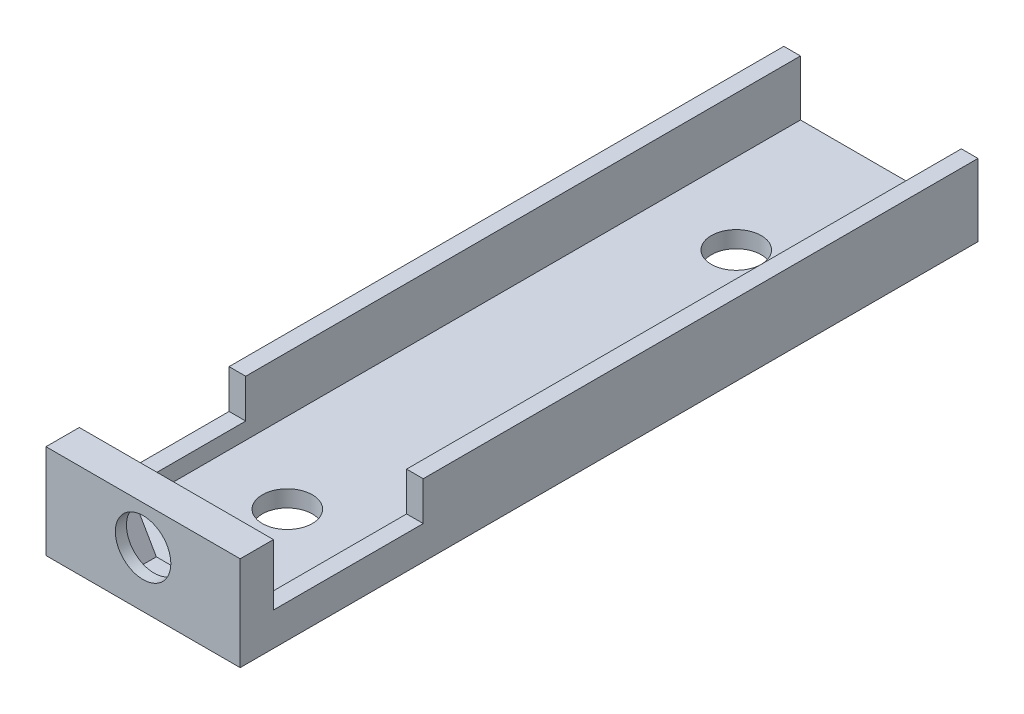
ISO-10303-21;
HEADER;
FILE_DESCRIPTION(('STEP AP214'),'2;1');
FILE_NAME('part.step','',(''),(''),'','','');
FILE_SCHEMA(('AUTOMOTIVE_DESIGN { 1 0 10303 214 1 1 1 1 }'));
ENDSEC;
DATA;
#1=APPLICATION_CONTEXT('core data for automotive mechanical design processes');
#2=APPLICATION_PROTOCOL_DEFINITION('international standard','automotive_design',2000,#1);
#3=PRODUCT_CONTEXT('',#1,'mechanical');
#4=PRODUCT('Part','Part','',(#3));
#5=PRODUCT_RELATED_PRODUCT_CATEGORY('part','',(#4));
#6=PRODUCT_DEFINITION_FORMATION('','',#4);
#7=PRODUCT_DEFINITION_CONTEXT('part definition',#1,'design');
#8=PRODUCT_DEFINITION('design','',#6,#7);
#9=PRODUCT_DEFINITION_SHAPE('','',#8);
#10=(LENGTH_UNIT() NAMED_UNIT(*) SI_UNIT(.MILLI.,.METRE.));
#11=(NAMED_UNIT(*) PLANE_ANGLE_UNIT() SI_UNIT($,.RADIAN.));
#12=(NAMED_UNIT(*) SI_UNIT($,.STERADIAN.) SOLID_ANGLE_UNIT());
#13=UNCERTAINTY_MEASURE_WITH_UNIT(LENGTH_MEASURE(1.E-05),#10,'distance_accuracy_value','');
#14=(GEOMETRIC_REPRESENTATION_CONTEXT(3) GLOBAL_UNCERTAINTY_ASSIGNED_CONTEXT((#13)) GLOBAL_UNIT_ASSIGNED_CONTEXT((#10,
#11,#12)) REPRESENTATION_CONTEXT('',''));
#15=CARTESIAN_POINT('',(0.,0.,0.));
#16=DIRECTION('',(0.,0.,1.));
#17=DIRECTION('',(1.,0.,0.));
#18=AXIS2_PLACEMENT_3D('',#15,#16,#17);
#19=CARTESIAN_POINT('',(32.,3.,100.));
#20=DIRECTION('',(1.,0.,0.));
#21=DIRECTION('',(0.,0.,-1.));
#22=AXIS2_PLACEMENT_3D('',#19,#20,#21);
#23=PLANE('',#22);
#24=DIRECTION('',(0.,-1.,0.));
#25=VECTOR('',#24,1.);
#26=CARTESIAN_POINT('',(32.,3.,127.));
#27=LINE('',#26,#25);
#28=CARTESIAN_POINT('',(32.,5.99999999999999,127.));
#29=VERTEX_POINT('',#28);
#30=CARTESIAN_POINT('',(32.,3.,127.));
#31=VERTEX_POINT('',#30);
#32=EDGE_CURVE('E303',#29,#31,#27,.T.);
#33=ORIENTED_EDGE('',*,*,#32,.F.);
#34=DIRECTION('',(0.,0.,-1.));
#35=VECTOR('',#34,1.);
#36=CARTESIAN_POINT('',(32.,5.99999999999999,131.));
#37=LINE('',#36,#35);
#38=CARTESIAN_POINT('',(32.,5.99999999999999,100.));
#39=VERTEX_POINT('',#38);
#40=EDGE_CURVE('E349',#29,#39,#37,.T.);
#41=ORIENTED_EDGE('',*,*,#40,.T.);
#42=DIRECTION('',(0.,-1.,0.));
#43=VECTOR('',#42,1.);
#44=CARTESIAN_POINT('',(32.,3.,100.));
#45=LINE('',#44,#43);
#46=CARTESIAN_POINT('',(32.,13.,100.));
#47=VERTEX_POINT('',#46);
#48=EDGE_CURVE('E364',#47,#39,#45,.T.);
#49=ORIENTED_EDGE('',*,*,#48,.F.);
#50=DIRECTION('',(0.,0.,-1.));
#51=VECTOR('',#50,1.);
#52=CARTESIAN_POINT('',(32.,13.,100.));
#53=LINE('',#52,#51);
#54=CARTESIAN_POINT('',(32.,13.,0.));
#55=VERTEX_POINT('',#54);
#56=EDGE_CURVE('E412',#47,#55,#53,.T.);
#57=ORIENTED_EDGE('',*,*,#56,.T.);
#58=DIRECTION('',(0.,-1.,0.));
#59=VECTOR('',#58,1.);
#60=CARTESIAN_POINT('',(32.,3.,0.));
#61=LINE('',#60,#59);
#62=CARTESIAN_POINT('',(32.,3.,0.));
#63=VERTEX_POINT('',#62);
#64=EDGE_CURVE('E384',#55,#63,#61,.T.);
#65=ORIENTED_EDGE('',*,*,#64,.T.);
#66=DIRECTION('',(0.,0.,-1.));
#67=VECTOR('',#66,1.);
#68=CARTESIAN_POINT('',(32.,3.,100.));
#69=LINE('',#68,#67);
#70=EDGE_CURVE('E409',#31,#63,#69,.T.);
#71=ORIENTED_EDGE('',*,*,#70,.F.);
#72=EDGE_LOOP('',(#33,#41,#49,#57,#65,#71));
#73=FACE_BOUND('',#72,.T.);
#74=ADVANCED_FACE('F45',(#73),#23,.F.);
#75=CARTESIAN_POINT('',(3.,2.99999999999999,100.));
#76=DIRECTION('',(0.,-1.,0.));
#77=DIRECTION('',(1.,0.,0.));
#78=AXIS2_PLACEMENT_3D('',#75,#76,#77);
#79=PLANE('',#78);
#80=CARTESIAN_POINT('',(17.5,3.,107.));
#81=DIRECTION('',(0.,1.,0.));
#82=DIRECTION('',(-1.,0.,0.));
#83=AXIS2_PLACEMENT_3D('',#80,#81,#82);
#84=CIRCLE('',#83,4.50000000000001);
#85=CARTESIAN_POINT('',(13.,2.99999999999999,107.));
#86=VERTEX_POINT('',#85);
#87=EDGE_CURVE('E235',#86,#86,#84,.T.);
#88=ORIENTED_EDGE('',*,*,#87,.F.);
#89=EDGE_LOOP('',(#88));
#90=FACE_BOUND('',#89,.T.);
#91=CARTESIAN_POINT('',(17.5,3.,26.075));
#92=DIRECTION('',(0.,1.,0.));
#93=DIRECTION('',(-1.,0.,0.));
#94=AXIS2_PLACEMENT_3D('',#91,#92,#93);
#95=CIRCLE('',#94,4.5);
#96=CARTESIAN_POINT('',(13.,2.99999999999999,26.075));
#97=VERTEX_POINT('',#96);
#98=EDGE_CURVE('E239',#97,#97,#95,.T.);
#99=ORIENTED_EDGE('',*,*,#98,.F.);
#100=EDGE_LOOP('',(#99));
#101=FACE_BOUND('',#100,.T.);
#102=DIRECTION('',(-1.,0.,0.));
#103=VECTOR('',#102,1.);
#104=CARTESIAN_POINT('',(3.,2.99999999999999,127.));
#105=LINE('',#104,#103);
#106=CARTESIAN_POINT('',(3.,2.99999999999999,127.));
#107=VERTEX_POINT('',#106);
#108=EDGE_CURVE('E331',#31,#107,#105,.T.);
#109=ORIENTED_EDGE('',*,*,#108,.F.);
#110=ORIENTED_EDGE('',*,*,#70,.T.);
#111=DIRECTION('',(-1.,0.,0.));
#112=VECTOR('',#111,1.);
#113=CARTESIAN_POINT('',(3.,2.99999999999999,0.));
#114=LINE('',#113,#112);
#115=CARTESIAN_POINT('',(3.,2.99999999999999,0.));
#116=VERTEX_POINT('',#115);
#117=EDGE_CURVE('E388',#63,#116,#114,.T.);
#118=ORIENTED_EDGE('',*,*,#117,.T.);
#119=DIRECTION('',(0.,0.,-1.));
#120=VECTOR('',#119,1.);
#121=CARTESIAN_POINT('',(3.,2.99999999999999,100.));
#122=LINE('',#121,#120);
#123=EDGE_CURVE('E406',#107,#116,#122,.T.);
#124=ORIENTED_EDGE('',*,*,#123,.F.);
#125=EDGE_LOOP('',(#109,#110,#118,#124));
#126=FACE_BOUND('',#125,.T.);
#127=ADVANCED_FACE('F469',(#90,#101,#126),#79,.F.);
#128=CARTESIAN_POINT('',(3.,13.,100.));
#129=DIRECTION('',(-1.,0.,0.));
#130=DIRECTION('',(0.,-1.,0.));
#131=AXIS2_PLACEMENT_3D('',#128,#129,#130);
#132=PLANE('',#131);
#133=DIRECTION('',(0.,1.,0.));
#134=VECTOR('',#133,1.);
#135=CARTESIAN_POINT('',(3.,13.,127.));
#136=LINE('',#135,#134);
#137=CARTESIAN_POINT('',(3.,5.99999999999999,127.));
#138=VERTEX_POINT('',#137);
#139=EDGE_CURVE('E334',#107,#138,#136,.T.);
#140=ORIENTED_EDGE('',*,*,#139,.F.);
#141=ORIENTED_EDGE('',*,*,#123,.T.);
#142=DIRECTION('',(0.,1.,0.));
#143=VECTOR('',#142,1.);
#144=CARTESIAN_POINT('',(3.,13.,0.));
#145=LINE('',#144,#143);
#146=CARTESIAN_POINT('',(3.,13.,0.));
#147=VERTEX_POINT('',#146);
#148=EDGE_CURVE('E392',#116,#147,#145,.T.);
#149=ORIENTED_EDGE('',*,*,#148,.T.);
#150=DIRECTION('',(0.,0.,-1.));
#151=VECTOR('',#150,1.);
#152=CARTESIAN_POINT('',(3.,13.,100.));
#153=LINE('',#152,#151);
#154=CARTESIAN_POINT('',(3.,13.,100.));
#155=VERTEX_POINT('',#154);
#156=EDGE_CURVE('E402',#155,#147,#153,.T.);
#157=ORIENTED_EDGE('',*,*,#156,.F.);
#158=DIRECTION('',(0.,1.,0.));
#159=VECTOR('',#158,1.);
#160=CARTESIAN_POINT('',(3.,13.,100.));
#161=LINE('',#160,#159);
#162=CARTESIAN_POINT('',(3.,5.99999999999999,100.));
#163=VERTEX_POINT('',#162);
#164=EDGE_CURVE('E368',#163,#155,#161,.T.);
#165=ORIENTED_EDGE('',*,*,#164,.F.);
#166=DIRECTION('',(0.,0.,-1.));
#167=VECTOR('',#166,1.);
#168=CARTESIAN_POINT('',(3.,5.99999999999999,131.));
#169=LINE('',#168,#167);
#170=EDGE_CURVE('E69',#138,#163,#169,.T.);
#171=ORIENTED_EDGE('',*,*,#170,.F.);
#172=EDGE_LOOP('',(#140,#141,#149,#157,#165,#171));
#173=FACE_BOUND('',#172,.T.);
#174=ADVANCED_FACE('F459',(#173),#132,.F.);
#175=CARTESIAN_POINT('',(0.,5.99999999999999,131.));
#176=DIRECTION('',(0.,-1.,0.));
#177=DIRECTION('',(0.,0.,-1.));
#178=AXIS2_PLACEMENT_3D('',#175,#176,#177);
#179=PLANE('',#178);
#180=DIRECTION('',(-1.,0.,0.));
#181=VECTOR('',#180,1.);
#182=CARTESIAN_POINT('',(0.,5.99999999999999,127.));
#183=LINE('',#182,#181);
#184=CARTESIAN_POINT('',(0.,5.99999999999999,127.));
#185=VERTEX_POINT('',#184);
#186=EDGE_CURVE('E337',#138,#185,#183,.T.);
#187=ORIENTED_EDGE('',*,*,#186,.F.);
#188=ORIENTED_EDGE('',*,*,#170,.T.);
#189=DIRECTION('',(-1.,0.,0.));
#190=VECTOR('',#189,1.);
#191=CARTESIAN_POINT('',(0.,5.99999999999999,100.));
#192=LINE('',#191,#190);
#193=CARTESIAN_POINT('',(0.,5.99999999999999,100.));
#194=VERTEX_POINT('',#193);
#195=EDGE_CURVE('E340',#163,#194,#192,.T.);
#196=ORIENTED_EDGE('',*,*,#195,.T.);
#197=DIRECTION('',(0.,0.,-1.));
#198=VECTOR('',#197,1.);
#199=CARTESIAN_POINT('',(0.,5.99999999999999,131.));
#200=LINE('',#199,#198);
#201=EDGE_CURVE('E61',#185,#194,#200,.T.);
#202=ORIENTED_EDGE('',*,*,#201,.F.);
#203=EDGE_LOOP('',(#187,#188,#196,#202));
#204=FACE_BOUND('',#203,.T.);
#205=ADVANCED_FACE('F452',(#204),#179,.F.);
#206=CARTESIAN_POINT('',(32.,5.99999999999999,131.));
#207=DIRECTION('',(0.,-1.,0.));
#208=DIRECTION('',(0.,0.,-1.));
#209=AXIS2_PLACEMENT_3D('',#206,#207,#208);
#210=PLANE('',#209);
#211=DIRECTION('',(-1.,0.,0.));
#212=VECTOR('',#211,1.);
#213=CARTESIAN_POINT('',(32.,5.99999999999999,127.));
#214=LINE('',#213,#212);
#215=CARTESIAN_POINT('',(35.,5.99999999999999,127.));
#216=VERTEX_POINT('',#215);
#217=EDGE_CURVE('E11',#216,#29,#214,.T.);
#218=ORIENTED_EDGE('',*,*,#217,.F.);
#219=DIRECTION('',(0.,0.,-1.));
#220=VECTOR('',#219,1.);
#221=CARTESIAN_POINT('',(35.,5.99999999999999,131.));
#222=LINE('',#221,#220);
#223=CARTESIAN_POINT('',(35.,5.99999999999999,100.));
#224=VERTEX_POINT('',#223);
#225=EDGE_CURVE('E352',#216,#224,#222,.T.);
#226=ORIENTED_EDGE('',*,*,#225,.T.);
#227=DIRECTION('',(-1.,0.,0.));
#228=VECTOR('',#227,1.);
#229=CARTESIAN_POINT('',(32.,5.99999999999999,100.));
#230=LINE('',#229,#228);
#231=EDGE_CURVE('E343',#224,#39,#230,.T.);
#232=ORIENTED_EDGE('',*,*,#231,.T.);
#233=ORIENTED_EDGE('',*,*,#40,.F.);
#234=EDGE_LOOP('',(#218,#226,#232,#233));
#235=FACE_BOUND('',#234,.T.);
#236=ADVANCED_FACE('F444',(#235),#210,.F.);
#237=CARTESIAN_POINT('',(0.,0.,100.));
#238=DIRECTION('',(0.,0.,-1.));
#239=DIRECTION('',(-1.,0.,0.));
#240=AXIS2_PLACEMENT_3D('',#237,#238,#239);
#241=PLANE('',#240);
#242=ORIENTED_EDGE('',*,*,#195,.F.);
#243=ORIENTED_EDGE('',*,*,#164,.T.);
#244=DIRECTION('',(-1.,0.,0.));
#245=VECTOR('',#244,1.);
#246=CARTESIAN_POINT('',(0.,13.,100.));
#247=LINE('',#246,#245);
#248=CARTESIAN_POINT('',(0.,13.,100.));
#249=VERTEX_POINT('',#248);
#250=EDGE_CURVE('E371',#155,#249,#247,.T.);
#251=ORIENTED_EDGE('',*,*,#250,.T.);
#252=DIRECTION('',(0.,-1.,0.));
#253=VECTOR('',#252,1.);
#254=CARTESIAN_POINT('',(0.,0.,100.));
#255=LINE('',#254,#253);
#256=EDGE_CURVE('E200',#249,#194,#255,.T.);
#257=ORIENTED_EDGE('',*,*,#256,.T.);
#258=EDGE_LOOP('',(#242,#243,#251,#257));
#259=FACE_BOUND('',#258,.T.);
#260=ADVANCED_FACE('F455',(#259),#241,.F.);
#261=ORIENTED_EDGE('',*,*,#231,.F.);
#262=DIRECTION('',(0.,1.,0.));
#263=VECTOR('',#262,1.);
#264=CARTESIAN_POINT('',(35.,13.,100.));
#265=LINE('',#264,#263);
#266=CARTESIAN_POINT('',(35.,13.,100.));
#267=VERTEX_POINT('',#266);
#268=EDGE_CURVE('E358',#224,#267,#265,.T.);
#269=ORIENTED_EDGE('',*,*,#268,.T.);
#270=DIRECTION('',(-1.,0.,0.));
#271=VECTOR('',#270,1.);
#272=CARTESIAN_POINT('',(32.,13.,100.));
#273=LINE('',#272,#271);
#274=EDGE_CURVE('E361',#267,#47,#273,.T.);
#275=ORIENTED_EDGE('',*,*,#274,.T.);
#276=ORIENTED_EDGE('',*,*,#48,.T.);
#277=EDGE_LOOP('',(#261,#269,#275,#276));
#278=FACE_BOUND('',#277,.T.);
#279=ADVANCED_FACE('F440',(#278),#241,.F.);
#280=CARTESIAN_POINT('',(35.,0.,100.));
#281=DIRECTION('',(0.,1.,0.));
#282=DIRECTION('',(-1.,0.,0.));
#283=AXIS2_PLACEMENT_3D('',#280,#281,#282);
#284=PLANE('',#283);
#285=CARTESIAN_POINT('',(17.5,0.,107.));
#286=DIRECTION('',(0.,1.,0.));
#287=DIRECTION('',(-1.,0.,0.));
#288=AXIS2_PLACEMENT_3D('',#285,#286,#287);
#289=CIRCLE('',#288,4.50000000000001);
#290=CARTESIAN_POINT('',(13.,0.,107.));
#291=VERTEX_POINT('',#290);
#292=EDGE_CURVE('E230',#291,#291,#289,.T.);
#293=ORIENTED_EDGE('',*,*,#292,.T.);
#294=EDGE_LOOP('',(#293));
#295=FACE_BOUND('',#294,.T.);
#296=CARTESIAN_POINT('',(17.5,0.,26.075));
#297=DIRECTION('',(0.,1.,0.));
#298=DIRECTION('',(-1.,0.,0.));
#299=AXIS2_PLACEMENT_3D('',#296,#297,#298);
#300=CIRCLE('',#299,4.5);
#301=CARTESIAN_POINT('',(13.,0.,26.075));
#302=VERTEX_POINT('',#301);
#303=EDGE_CURVE('E228',#302,#302,#300,.T.);
#304=ORIENTED_EDGE('',*,*,#303,.T.);
#305=EDGE_LOOP('',(#304));
#306=FACE_BOUND('',#305,.T.);
#307=DIRECTION('',(0.,0.,-1.));
#308=VECTOR('',#307,1.);
#309=CARTESIAN_POINT('',(0.,0.,100.));
#310=LINE('',#309,#308);
#311=CARTESIAN_POINT('',(0.,0.,133.));
#312=VERTEX_POINT('',#311);
#313=CARTESIAN_POINT('',(0.,0.,0.));
#314=VERTEX_POINT('',#313);
#315=EDGE_CURVE('E185',#312,#314,#310,.T.);
#316=ORIENTED_EDGE('',*,*,#315,.T.);
#317=DIRECTION('',(1.,0.,0.));
#318=VECTOR('',#317,1.);
#319=CARTESIAN_POINT('',(35.,0.,0.));
#320=LINE('',#319,#318);
#321=CARTESIAN_POINT('',(35.,0.,0.));
#322=VERTEX_POINT('',#321);
#323=EDGE_CURVE('E357',#314,#322,#320,.T.);
#324=ORIENTED_EDGE('',*,*,#323,.T.);
#325=DIRECTION('',(0.,0.,-1.));
#326=VECTOR('',#325,1.);
#327=CARTESIAN_POINT('',(35.,0.,100.));
#328=LINE('',#327,#326);
#329=CARTESIAN_POINT('',(35.,0.,133.));
#330=VERTEX_POINT('',#329);
#331=EDGE_CURVE('E54',#330,#322,#328,.T.);
#332=ORIENTED_EDGE('',*,*,#331,.F.);
#333=DIRECTION('',(1.,0.,0.));
#334=VECTOR('',#333,1.);
#335=CARTESIAN_POINT('',(0.,0.,133.));
#336=LINE('',#335,#334);
#337=EDGE_CURVE('E203',#312,#330,#336,.T.);
#338=ORIENTED_EDGE('',*,*,#337,.F.);
#339=EDGE_LOOP('',(#316,#324,#332,#338));
#340=FACE_BOUND('',#339,.T.);
#341=ADVANCED_FACE('F47',(#295,#306,#340),#284,.F.);
#342=CARTESIAN_POINT('',(35.,13.,100.));
#343=DIRECTION('',(-1.,0.,0.));
#344=DIRECTION('',(0.,0.,1.));
#345=AXIS2_PLACEMENT_3D('',#342,#343,#344);
#346=PLANE('',#345);
#347=ORIENTED_EDGE('',*,*,#331,.T.);
#348=DIRECTION('',(0.,1.,0.));
#349=VECTOR('',#348,1.);
#350=CARTESIAN_POINT('',(35.,13.,0.));
#351=LINE('',#350,#349);
#352=CARTESIAN_POINT('',(35.,13.,0.));
#353=VERTEX_POINT('',#352);
#354=EDGE_CURVE('E378',#322,#353,#351,.T.);
#355=ORIENTED_EDGE('',*,*,#354,.T.);
#356=DIRECTION('',(0.,0.,-1.));
#357=VECTOR('',#356,1.);
#358=CARTESIAN_POINT('',(35.,13.,100.));
#359=LINE('',#358,#357);
#360=EDGE_CURVE('E416',#267,#353,#359,.T.);
#361=ORIENTED_EDGE('',*,*,#360,.F.);
#362=ORIENTED_EDGE('',*,*,#268,.F.);
#363=ORIENTED_EDGE('',*,*,#225,.F.);
#364=DIRECTION('',(0.,1.,0.));
#365=VECTOR('',#364,1.);
#366=CARTESIAN_POINT('',(35.,0.,127.));
#367=LINE('',#366,#365);
#368=CARTESIAN_POINT('',(35.,17.,127.));
#369=VERTEX_POINT('',#368);
#370=EDGE_CURVE('E249',#216,#369,#367,.T.);
#371=ORIENTED_EDGE('',*,*,#370,.T.);
#372=DIRECTION('',(0.,0.,1.));
#373=VECTOR('',#372,1.);
#374=CARTESIAN_POINT('',(35.,17.,127.));
#375=LINE('',#374,#373);
#376=CARTESIAN_POINT('',(35.,17.,133.));
#377=VERTEX_POINT('',#376);
#378=EDGE_CURVE('E276',#369,#377,#375,.T.);
#379=ORIENTED_EDGE('',*,*,#378,.T.);
#380=DIRECTION('',(0.,1.,0.));
#381=VECTOR('',#380,1.);
#382=CARTESIAN_POINT('',(35.,0.,133.));
#383=LINE('',#382,#381);
#384=EDGE_CURVE('E208',#330,#377,#383,.T.);
#385=ORIENTED_EDGE('',*,*,#384,.F.);
#386=EDGE_LOOP('',(#347,#355,#361,#362,#363,#371,#379,#385));
#387=FACE_BOUND('',#386,.T.);
#388=ADVANCED_FACE('F422',(#387),#346,.F.);
#389=CARTESIAN_POINT('',(32.,13.,100.));
#390=DIRECTION('',(0.,-1.,0.));
#391=DIRECTION('',(1.,0.,0.));
#392=AXIS2_PLACEMENT_3D('',#389,#390,#391);
#393=PLANE('',#392);
#394=DIRECTION('',(-1.,0.,0.));
#395=VECTOR('',#394,1.);
#396=CARTESIAN_POINT('',(32.,13.,0.));
#397=LINE('',#396,#395);
#398=EDGE_CURVE('E381',#353,#55,#397,.T.);
#399=ORIENTED_EDGE('',*,*,#398,.T.);
#400=ORIENTED_EDGE('',*,*,#56,.F.);
#401=ORIENTED_EDGE('',*,*,#274,.F.);
#402=ORIENTED_EDGE('',*,*,#360,.T.);
#403=EDGE_LOOP('',(#399,#400,#401,#402));
#404=FACE_BOUND('',#403,.T.);
#405=ADVANCED_FACE('F431',(#404),#393,.F.);
#406=CARTESIAN_POINT('',(0.,13.,100.));
#407=DIRECTION('',(0.,-1.,0.));
#408=DIRECTION('',(0.,0.,-1.));
#409=AXIS2_PLACEMENT_3D('',#406,#407,#408);
#410=PLANE('',#409);
#411=DIRECTION('',(-1.,0.,0.));
#412=VECTOR('',#411,1.);
#413=CARTESIAN_POINT('',(0.,13.,0.));
#414=LINE('',#413,#412);
#415=CARTESIAN_POINT('',(0.,13.,0.));
#416=VERTEX_POINT('',#415);
#417=EDGE_CURVE('E395',#147,#416,#414,.T.);
#418=ORIENTED_EDGE('',*,*,#417,.T.);
#419=DIRECTION('',(0.,0.,-1.));
#420=VECTOR('',#419,1.);
#421=CARTESIAN_POINT('',(0.,13.,100.));
#422=LINE('',#421,#420);
#423=EDGE_CURVE('E199',#249,#416,#422,.T.);
#424=ORIENTED_EDGE('',*,*,#423,.F.);
#425=ORIENTED_EDGE('',*,*,#250,.F.);
#426=ORIENTED_EDGE('',*,*,#156,.T.);
#427=EDGE_LOOP('',(#418,#424,#425,#426));
#428=FACE_BOUND('',#427,.T.);
#429=ADVANCED_FACE('F465',(#428),#410,.F.);
#430=CARTESIAN_POINT('',(0.,0.,100.));
#431=DIRECTION('',(1.,0.,0.));
#432=DIRECTION('',(0.,0.,-1.));
#433=AXIS2_PLACEMENT_3D('',#430,#431,#432);
#434=PLANE('',#433);
#435=ORIENTED_EDGE('',*,*,#315,.F.);
#436=DIRECTION('',(0.,1.,0.));
#437=VECTOR('',#436,1.);
#438=CARTESIAN_POINT('',(0.,0.,133.));
#439=LINE('',#438,#437);
#440=CARTESIAN_POINT('',(0.,17.,133.));
#441=VERTEX_POINT('',#440);
#442=EDGE_CURVE('E190',#312,#441,#439,.T.);
#443=ORIENTED_EDGE('',*,*,#442,.T.);
#444=DIRECTION('',(0.,0.,1.));
#445=VECTOR('',#444,1.);
#446=CARTESIAN_POINT('',(0.,17.,127.));
#447=LINE('',#446,#445);
#448=CARTESIAN_POINT('',(0.,17.,127.));
#449=VERTEX_POINT('',#448);
#450=EDGE_CURVE('E324',#449,#441,#447,.T.);
#451=ORIENTED_EDGE('',*,*,#450,.F.);
#452=DIRECTION('',(0.,1.,0.));
#453=VECTOR('',#452,1.);
#454=CARTESIAN_POINT('',(0.,0.,127.));
#455=LINE('',#454,#453);
#456=EDGE_CURVE('E246',#185,#449,#455,.T.);
#457=ORIENTED_EDGE('',*,*,#456,.F.);
#458=ORIENTED_EDGE('',*,*,#201,.T.);
#459=ORIENTED_EDGE('',*,*,#256,.F.);
#460=ORIENTED_EDGE('',*,*,#423,.T.);
#461=DIRECTION('',(0.,-1.,0.));
#462=VECTOR('',#461,1.);
#463=CARTESIAN_POINT('',(0.,0.,0.));
#464=LINE('',#463,#462);
#465=EDGE_CURVE('E194',#416,#314,#464,.T.);
#466=ORIENTED_EDGE('',*,*,#465,.T.);
#467=EDGE_LOOP('',(#435,#443,#451,#457,#458,#459,#460,#466));
#468=FACE_BOUND('',#467,.T.);
#469=ADVANCED_FACE('F187',(#468),#434,.F.);
#470=CARTESIAN_POINT('',(0.,0.,0.));
#471=DIRECTION('',(0.,0.,-1.));
#472=DIRECTION('',(-1.,0.,0.));
#473=AXIS2_PLACEMENT_3D('',#470,#471,#472);
#474=PLANE('',#473);
#475=ORIENTED_EDGE('',*,*,#323,.F.);
#476=ORIENTED_EDGE('',*,*,#465,.F.);
#477=ORIENTED_EDGE('',*,*,#417,.F.);
#478=ORIENTED_EDGE('',*,*,#148,.F.);
#479=ORIENTED_EDGE('',*,*,#117,.F.);
#480=ORIENTED_EDGE('',*,*,#64,.F.);
#481=ORIENTED_EDGE('',*,*,#398,.F.);
#482=ORIENTED_EDGE('',*,*,#354,.F.);
#483=EDGE_LOOP('',(#475,#476,#477,#478,#479,#480,#481,#482));
#484=FACE_BOUND('',#483,.T.);
#485=ADVANCED_FACE('F426',(#484),#474,.T.);
#486=CARTESIAN_POINT('',(0.,0.,127.));
#487=DIRECTION('',(0.,0.,1.));
#488=DIRECTION('',(1.,0.,0.));
#489=AXIS2_PLACEMENT_3D('',#486,#487,#488);
#490=PLANE('',#489);
#491=DIRECTION('',(0.5,0.866025403784439,0.));
#492=VECTOR('',#491,1.);
#493=CARTESIAN_POINT('',(14.2075317547305,-8.20272228311384,127.));
#494=LINE('',#493,#492);
#495=CARTESIAN_POINT('',(21.1084391824352,3.75,127.));
#496=VERTEX_POINT('',#495);
#497=CARTESIAN_POINT('',(24.7168783648703,10.,127.));
#498=VERTEX_POINT('',#497);
#499=EDGE_CURVE('E257',#496,#498,#494,.T.);
#500=ORIENTED_EDGE('',*,*,#499,.T.);
#501=DIRECTION('',(-0.5,0.866025403784439,0.));
#502=VECTOR('',#501,1.);
#503=CARTESIAN_POINT('',(22.8677857925749,13.2027222831138,127.));
#504=LINE('',#503,#502);
#505=CARTESIAN_POINT('',(21.1084391824352,16.25,127.));
#506=VERTEX_POINT('',#505);
#507=EDGE_CURVE('E273',#498,#506,#504,.T.);
#508=ORIENTED_EDGE('',*,*,#507,.T.);
#509=DIRECTION('',(-1.,0.,0.));
#510=VECTOR('',#509,1.);
#511=CARTESIAN_POINT('',(0.,16.25,127.));
#512=LINE('',#511,#510);
#513=CARTESIAN_POINT('',(13.8915608175648,16.25,127.));
#514=VERTEX_POINT('',#513);
#515=EDGE_CURVE('E270',#506,#514,#512,.T.);
#516=ORIENTED_EDGE('',*,*,#515,.T.);
#517=DIRECTION('',(-0.5,-0.866025403784438,0.));
#518=VECTOR('',#517,1.);
#519=CARTESIAN_POINT('',(3.38221420742506,-1.95272228311384,127.));
#520=LINE('',#519,#518);
#521=CARTESIAN_POINT('',(10.2831216351297,10.,127.));
#522=VERTEX_POINT('',#521);
#523=EDGE_CURVE('E267',#514,#522,#520,.T.);
#524=ORIENTED_EDGE('',*,*,#523,.T.);
#525=DIRECTION('',(0.5,-0.866025403784439,0.));
#526=VECTOR('',#525,1.);
#527=CARTESIAN_POINT('',(12.0424682452695,6.95272228311383,127.));
#528=LINE('',#527,#526);
#529=CARTESIAN_POINT('',(13.8915608175648,3.75,127.));
#530=VERTEX_POINT('',#529);
#531=EDGE_CURVE('E264',#522,#530,#528,.T.);
#532=ORIENTED_EDGE('',*,*,#531,.T.);
#533=DIRECTION('',(1.,0.,0.));
#534=VECTOR('',#533,1.);
#535=CARTESIAN_POINT('',(0.,3.75,127.));
#536=LINE('',#535,#534);
#537=EDGE_CURVE('E261',#530,#496,#536,.T.);
#538=ORIENTED_EDGE('',*,*,#537,.T.);
#539=EDGE_LOOP('',(#500,#508,#516,#524,#532,#538));
#540=FACE_BOUND('',#539,.T.);
#541=ORIENTED_EDGE('',*,*,#139,.T.);
#542=ORIENTED_EDGE('',*,*,#186,.T.);
#543=ORIENTED_EDGE('',*,*,#456,.T.);
#544=DIRECTION('',(1.,0.,0.));
#545=VECTOR('',#544,1.);
#546=CARTESIAN_POINT('',(0.,17.,127.));
#547=LINE('',#546,#545);
#548=EDGE_CURVE('E253',#449,#369,#547,.T.);
#549=ORIENTED_EDGE('',*,*,#548,.T.);
#550=ORIENTED_EDGE('',*,*,#370,.F.);
#551=ORIENTED_EDGE('',*,*,#217,.T.);
#552=ORIENTED_EDGE('',*,*,#32,.T.);
#553=ORIENTED_EDGE('',*,*,#108,.T.);
#554=EDGE_LOOP('',(#541,#542,#543,#549,#550,#551,#552,#553));
#555=FACE_BOUND('',#554,.T.);
#556=ADVANCED_FACE('F449',(#540,#555),#490,.F.);
#557=CARTESIAN_POINT('',(14.2075317547305,-8.20272228311384,127.));
#558=DIRECTION('',(0.866025403784438,-0.5,0.));
#559=DIRECTION('',(0.5,0.866025403784439,0.));
#560=AXIS2_PLACEMENT_3D('',#557,#558,#559);
#561=PLANE('',#560);
#562=DIRECTION('',(0.5,0.866025403784439,0.));
#563=VECTOR('',#562,1.);
#564=CARTESIAN_POINT('',(14.2075317547305,-8.20272228311384,131.));
#565=LINE('',#564,#563);
#566=CARTESIAN_POINT('',(21.1084391824352,3.75,131.));
#567=VERTEX_POINT('',#566);
#568=CARTESIAN_POINT('',(24.7168783648703,10.,131.));
#569=VERTEX_POINT('',#568);
#570=EDGE_CURVE('E234',#567,#569,#565,.T.);
#571=ORIENTED_EDGE('',*,*,#570,.T.);
#572=DIRECTION('',(0.,0.,1.));
#573=VECTOR('',#572,1.);
#574=CARTESIAN_POINT('',(24.7168783648703,10.,127.));
#575=LINE('',#574,#573);
#576=EDGE_CURVE('E299',#498,#569,#575,.T.);
#577=ORIENTED_EDGE('',*,*,#576,.F.);
#578=ORIENTED_EDGE('',*,*,#499,.F.);
#579=DIRECTION('',(0.,0.,1.));
#580=VECTOR('',#579,1.);
#581=CARTESIAN_POINT('',(21.1084391824352,3.75,127.));
#582=LINE('',#581,#580);
#583=EDGE_CURVE('E320',#496,#567,#582,.T.);
#584=ORIENTED_EDGE('',*,*,#583,.T.);
#585=EDGE_LOOP('',(#571,#577,#578,#584));
#586=FACE_BOUND('',#585,.T.);
#587=ADVANCED_FACE('F517',(#586),#561,.F.);
#588=CARTESIAN_POINT('',(22.8677857925749,13.2027222831138,127.));
#589=DIRECTION('',(0.866025403784439,0.5,0.));
#590=DIRECTION('',(-0.5,0.866025403784439,0.));
#591=AXIS2_PLACEMENT_3D('',#588,#589,#590);
#592=PLANE('',#591);
#593=DIRECTION('',(-0.5,0.866025403784439,0.));
#594=VECTOR('',#593,1.);
#595=CARTESIAN_POINT('',(22.8677857925749,13.2027222831138,131.));
#596=LINE('',#595,#594);
#597=CARTESIAN_POINT('',(21.1084391824352,16.25,131.));
#598=VERTEX_POINT('',#597);
#599=EDGE_CURVE('E250',#569,#598,#596,.T.);
#600=ORIENTED_EDGE('',*,*,#599,.T.);
#601=DIRECTION('',(0.,0.,1.));
#602=VECTOR('',#601,1.);
#603=CARTESIAN_POINT('',(21.1084391824352,16.25,127.));
#604=LINE('',#603,#602);
#605=EDGE_CURVE('E304',#506,#598,#604,.T.);
#606=ORIENTED_EDGE('',*,*,#605,.F.);
#607=ORIENTED_EDGE('',*,*,#507,.F.);
#608=ORIENTED_EDGE('',*,*,#576,.T.);
#609=EDGE_LOOP('',(#600,#606,#607,#608));
#610=FACE_BOUND('',#609,.T.);
#611=ADVANCED_FACE('F519',(#610),#592,.F.);
#612=CARTESIAN_POINT('',(0.,16.25,127.));
#613=DIRECTION('',(0.,1.,0.));
#614=DIRECTION('',(0.,0.,1.));
#615=AXIS2_PLACEMENT_3D('',#612,#613,#614);
#616=PLANE('',#615);
#617=DIRECTION('',(-1.,0.,0.));
#618=VECTOR('',#617,1.);
#619=CARTESIAN_POINT('',(0.,16.25,131.));
#620=LINE('',#619,#618);
#621=CARTESIAN_POINT('',(13.8915608175648,16.25,131.));
#622=VERTEX_POINT('',#621);
#623=EDGE_CURVE('E292',#598,#622,#620,.T.);
#624=ORIENTED_EDGE('',*,*,#623,.T.);
#625=DIRECTION('',(0.,0.,1.));
#626=VECTOR('',#625,1.);
#627=CARTESIAN_POINT('',(13.8915608175648,16.25,127.));
#628=LINE('',#627,#626);
#629=EDGE_CURVE('E308',#514,#622,#628,.T.);
#630=ORIENTED_EDGE('',*,*,#629,.F.);
#631=ORIENTED_EDGE('',*,*,#515,.F.);
#632=ORIENTED_EDGE('',*,*,#605,.T.);
#633=EDGE_LOOP('',(#624,#630,#631,#632));
#634=FACE_BOUND('',#633,.T.);
#635=ADVANCED_FACE('F522',(#634),#616,.F.);
#636=CARTESIAN_POINT('',(3.38221420742506,-1.95272228311384,127.));
#637=DIRECTION('',(-0.866025403784438,0.5,0.));
#638=DIRECTION('',(-0.5,-0.866025403784438,0.));
#639=AXIS2_PLACEMENT_3D('',#636,#637,#638);
#640=PLANE('',#639);
#641=DIRECTION('',(-0.5,-0.866025403784438,0.));
#642=VECTOR('',#641,1.);
#643=CARTESIAN_POINT('',(3.38221420742506,-1.95272228311384,131.));
#644=LINE('',#643,#642);
#645=CARTESIAN_POINT('',(10.2831216351297,10.,131.));
#646=VERTEX_POINT('',#645);
#647=EDGE_CURVE('E288',#622,#646,#644,.T.);
#648=ORIENTED_EDGE('',*,*,#647,.T.);
#649=DIRECTION('',(0.,0.,1.));
#650=VECTOR('',#649,1.);
#651=CARTESIAN_POINT('',(10.2831216351297,10.,127.));
#652=LINE('',#651,#650);
#653=EDGE_CURVE('E312',#522,#646,#652,.T.);
#654=ORIENTED_EDGE('',*,*,#653,.F.);
#655=ORIENTED_EDGE('',*,*,#523,.F.);
#656=ORIENTED_EDGE('',*,*,#629,.T.);
#657=EDGE_LOOP('',(#648,#654,#655,#656));
#658=FACE_BOUND('',#657,.T.);
#659=ADVANCED_FACE('F526',(#658),#640,.F.);
#660=CARTESIAN_POINT('',(12.0424682452695,6.95272228311383,127.));
#661=DIRECTION('',(-0.866025403784439,-0.5,0.));
#662=DIRECTION('',(0.5,-0.866025403784439,0.));
#663=AXIS2_PLACEMENT_3D('',#660,#661,#662);
#664=PLANE('',#663);
#665=DIRECTION('',(0.5,-0.866025403784439,0.));
#666=VECTOR('',#665,1.);
#667=CARTESIAN_POINT('',(12.0424682452695,6.95272228311383,131.));
#668=LINE('',#667,#666);
#669=CARTESIAN_POINT('',(13.8915608175648,3.75,131.));
#670=VERTEX_POINT('',#669);
#671=EDGE_CURVE('E284',#646,#670,#668,.T.);
#672=ORIENTED_EDGE('',*,*,#671,.T.);
#673=DIRECTION('',(0.,0.,1.));
#674=VECTOR('',#673,1.);
#675=CARTESIAN_POINT('',(13.8915608175648,3.75,127.));
#676=LINE('',#675,#674);
#677=EDGE_CURVE('E316',#530,#670,#676,.T.);
#678=ORIENTED_EDGE('',*,*,#677,.F.);
#679=ORIENTED_EDGE('',*,*,#531,.F.);
#680=ORIENTED_EDGE('',*,*,#653,.T.);
#681=EDGE_LOOP('',(#672,#678,#679,#680));
#682=FACE_BOUND('',#681,.T.);
#683=ADVANCED_FACE('F530',(#682),#664,.F.);
#684=CARTESIAN_POINT('',(0.,17.,127.));
#685=DIRECTION('',(0.,-1.,0.));
#686=DIRECTION('',(0.,0.,-1.));
#687=AXIS2_PLACEMENT_3D('',#684,#685,#686);
#688=PLANE('',#687);
#689=ORIENTED_EDGE('',*,*,#450,.T.);
#690=DIRECTION('',(1.,0.,0.));
#691=VECTOR('',#690,1.);
#692=CARTESIAN_POINT('',(0.,17.,133.));
#693=LINE('',#692,#691);
#694=EDGE_CURVE('E213',#441,#377,#693,.T.);
#695=ORIENTED_EDGE('',*,*,#694,.T.);
#696=ORIENTED_EDGE('',*,*,#378,.F.);
#697=ORIENTED_EDGE('',*,*,#548,.F.);
#698=EDGE_LOOP('',(#689,#695,#696,#697));
#699=FACE_BOUND('',#698,.T.);
#700=ADVANCED_FACE('F451',(#699),#688,.F.);
#701=CARTESIAN_POINT('',(0.,3.75,127.));
#702=DIRECTION('',(0.,-1.,0.));
#703=DIRECTION('',(1.,0.,0.));
#704=AXIS2_PLACEMENT_3D('',#701,#702,#703);
#705=PLANE('',#704);
#706=DIRECTION('',(1.,0.,0.));
#707=VECTOR('',#706,1.);
#708=CARTESIAN_POINT('',(0.,3.75,131.));
#709=LINE('',#708,#707);
#710=EDGE_CURVE('E280',#670,#567,#709,.T.);
#711=ORIENTED_EDGE('',*,*,#710,.T.);
#712=ORIENTED_EDGE('',*,*,#583,.F.);
#713=ORIENTED_EDGE('',*,*,#537,.F.);
#714=ORIENTED_EDGE('',*,*,#677,.T.);
#715=EDGE_LOOP('',(#711,#712,#713,#714));
#716=FACE_BOUND('',#715,.T.);
#717=ADVANCED_FACE('F501',(#716),#705,.F.);
#718=CARTESIAN_POINT('',(17.5,0.,26.075));
#719=DIRECTION('',(0.,1.,0.));
#720=DIRECTION('',(-1.,0.,0.));
#721=AXIS2_PLACEMENT_3D('',#718,#719,#720);
#722=CYLINDRICAL_SURFACE('',#721,4.5);
#723=ORIENTED_EDGE('',*,*,#303,.F.);
#724=EDGE_LOOP('',(#723));
#725=FACE_BOUND('',#724,.T.);
#726=ORIENTED_EDGE('',*,*,#98,.T.);
#727=EDGE_LOOP('',(#726));
#728=FACE_BOUND('',#727,.T.);
#729=ADVANCED_FACE('F497',(#725,#728),#722,.F.);
#730=CARTESIAN_POINT('',(17.5,0.,107.));
#731=DIRECTION('',(0.,1.,0.));
#732=DIRECTION('',(-1.,0.,0.));
#733=AXIS2_PLACEMENT_3D('',#730,#731,#732);
#734=CYLINDRICAL_SURFACE('',#733,4.50000000000001);
#735=ORIENTED_EDGE('',*,*,#292,.F.);
#736=EDGE_LOOP('',(#735));
#737=FACE_BOUND('',#736,.T.);
#738=ORIENTED_EDGE('',*,*,#87,.T.);
#739=EDGE_LOOP('',(#738));
#740=FACE_BOUND('',#739,.T.);
#741=ADVANCED_FACE('F500',(#737,#740),#734,.F.);
#742=CARTESIAN_POINT('',(17.5,10.,133.));
#743=DIRECTION('',(0.,0.,-1.));
#744=DIRECTION('',(-1.,0.,0.));
#745=AXIS2_PLACEMENT_3D('',#742,#743,#744);
#746=CYLINDRICAL_SURFACE('',#745,5.);
#747=CARTESIAN_POINT('',(17.5,10.,133.));
#748=DIRECTION('',(0.,0.,1.));
#749=DIRECTION('',(1.,0.,0.));
#750=AXIS2_PLACEMENT_3D('',#747,#748,#749);
#751=CIRCLE('',#750,5.);
#752=CARTESIAN_POINT('',(22.5,10.,133.));
#753=VERTEX_POINT('',#752);
#754=EDGE_CURVE('E225',#753,#753,#751,.T.);
#755=ORIENTED_EDGE('',*,*,#754,.T.);
#756=EDGE_LOOP('',(#755));
#757=FACE_BOUND('',#756,.T.);
#758=CARTESIAN_POINT('',(17.5,10.,131.));
#759=DIRECTION('',(0.,0.,1.));
#760=DIRECTION('',(1.,0.,0.));
#761=AXIS2_PLACEMENT_3D('',#758,#759,#760);
#762=CIRCLE('',#761,5.);
#763=CARTESIAN_POINT('',(22.5,10.,131.));
#764=VERTEX_POINT('',#763);
#765=EDGE_CURVE('E215',#764,#764,#762,.T.);
#766=ORIENTED_EDGE('',*,*,#765,.F.);
#767=EDGE_LOOP('',(#766));
#768=FACE_BOUND('',#767,.T.);
#769=ADVANCED_FACE('F508',(#757,#768),#746,.F.);
#770=CARTESIAN_POINT('',(0.,0.,133.));
#771=DIRECTION('',(0.,0.,1.));
#772=DIRECTION('',(1.,0.,0.));
#773=AXIS2_PLACEMENT_3D('',#770,#771,#772);
#774=PLANE('',#773);
#775=ORIENTED_EDGE('',*,*,#442,.F.);
#776=ORIENTED_EDGE('',*,*,#337,.T.);
#777=ORIENTED_EDGE('',*,*,#384,.T.);
#778=ORIENTED_EDGE('',*,*,#694,.F.);
#779=EDGE_LOOP('',(#775,#776,#777,#778));
#780=FACE_BOUND('',#779,.T.);
#781=ORIENTED_EDGE('',*,*,#754,.F.);
#782=EDGE_LOOP('',(#781));
#783=FACE_BOUND('',#782,.T.);
#784=ADVANCED_FACE('F210',(#780,#783),#774,.T.);
#785=CARTESIAN_POINT('',(0.,0.,131.));
#786=DIRECTION('',(0.,0.,1.));
#787=DIRECTION('',(1.,0.,0.));
#788=AXIS2_PLACEMENT_3D('',#785,#786,#787);
#789=PLANE('',#788);
#790=ORIENTED_EDGE('',*,*,#570,.F.);
#791=ORIENTED_EDGE('',*,*,#710,.F.);
#792=ORIENTED_EDGE('',*,*,#671,.F.);
#793=ORIENTED_EDGE('',*,*,#647,.F.);
#794=ORIENTED_EDGE('',*,*,#623,.F.);
#795=ORIENTED_EDGE('',*,*,#599,.F.);
#796=EDGE_LOOP('',(#790,#791,#792,#793,#794,#795));
#797=FACE_BOUND('',#796,.T.);
#798=ORIENTED_EDGE('',*,*,#765,.T.);
#799=EDGE_LOOP('',(#798));
#800=FACE_BOUND('',#799,.T.);
#801=ADVANCED_FACE('F617',(#797,#800),#789,.F.);
#802=CLOSED_SHELL('',(#74,#127,#174,#205,#236,#260,#279,#341,#388,#405,#429,#469,#485,#556,#587,
#611,#635,#659,#683,#700,#717,#729,#741,#769,#784,#801));
#803=MANIFOLD_SOLID_BREP('B2',#802);
#804=ADVANCED_BREP_SHAPE_REPRESENTATION('',(#18,#803),#14);
#805=SHAPE_DEFINITION_REPRESENTATION(#9,#804);
ENDSEC;
END-ISO-10303-21;
